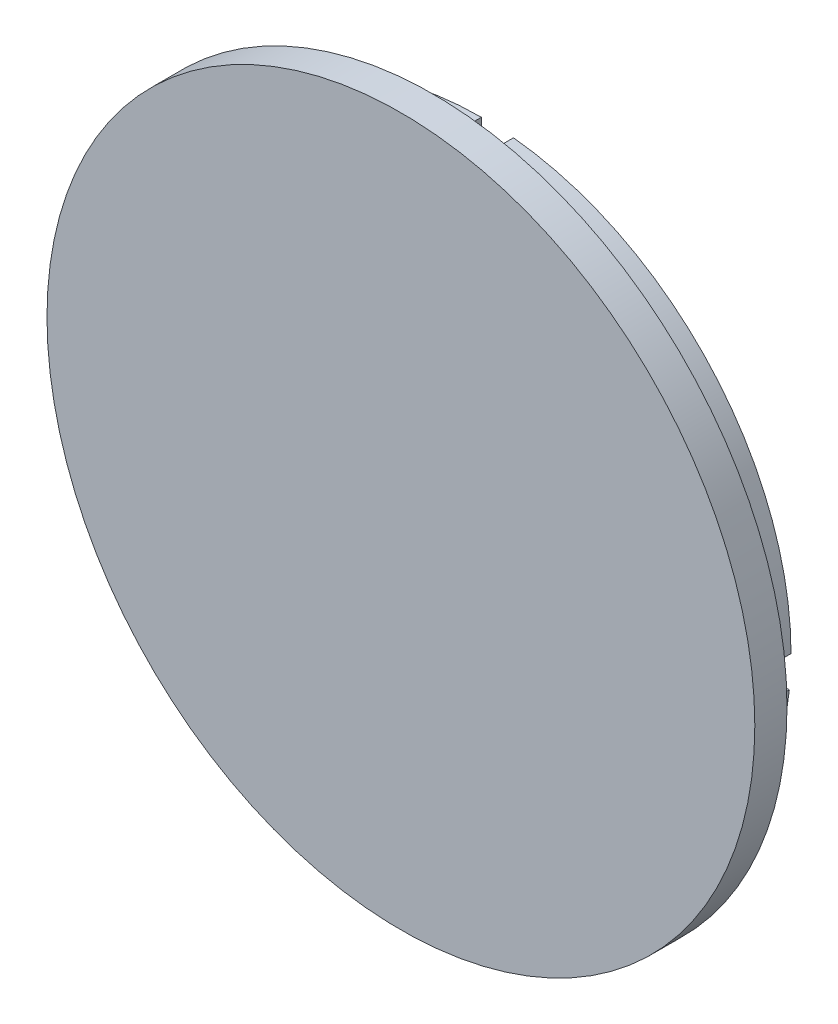
ISO-10303-21;
HEADER;
FILE_DESCRIPTION(('STEP AP214'),'2;1');
FILE_NAME('part.step','',(''),(''),'','','');
FILE_SCHEMA(('AUTOMOTIVE_DESIGN { 1 0 10303 214 1 1 1 1 }'));
ENDSEC;
DATA;
#1=APPLICATION_CONTEXT('core data for automotive mechanical design processes');
#2=APPLICATION_PROTOCOL_DEFINITION('international standard','automotive_design',2000,#1);
#3=PRODUCT_CONTEXT('',#1,'mechanical');
#4=PRODUCT('Part','Part','',(#3));
#5=PRODUCT_RELATED_PRODUCT_CATEGORY('part','',(#4));
#6=PRODUCT_DEFINITION_FORMATION('','',#4);
#7=PRODUCT_DEFINITION_CONTEXT('part definition',#1,'design');
#8=PRODUCT_DEFINITION('design','',#6,#7);
#9=PRODUCT_DEFINITION_SHAPE('','',#8);
#10=(LENGTH_UNIT() NAMED_UNIT(*) SI_UNIT(.MILLI.,.METRE.));
#11=(NAMED_UNIT(*) PLANE_ANGLE_UNIT() SI_UNIT($,.RADIAN.));
#12=(NAMED_UNIT(*) SI_UNIT($,.STERADIAN.) SOLID_ANGLE_UNIT());
#13=UNCERTAINTY_MEASURE_WITH_UNIT(LENGTH_MEASURE(1.E-05),#10,'distance_accuracy_value','');
#14=(GEOMETRIC_REPRESENTATION_CONTEXT(3) GLOBAL_UNCERTAINTY_ASSIGNED_CONTEXT((#13)) GLOBAL_UNIT_ASSIGNED_CONTEXT((#10,
#11,#12)) REPRESENTATION_CONTEXT('',''));
#15=CARTESIAN_POINT('',(0.,0.,0.));
#16=DIRECTION('',(0.,0.,1.));
#17=DIRECTION('',(1.,0.,0.));
#18=AXIS2_PLACEMENT_3D('',#15,#16,#17);
#19=CARTESIAN_POINT('',(0.,0.,0.));
#20=DIRECTION('',(0.,0.,1.));
#21=DIRECTION('',(1.,0.,0.));
#22=AXIS2_PLACEMENT_3D('',#19,#20,#21);
#23=PLANE('',#22);
#24=DIRECTION('',(1.,0.,0.));
#25=VECTOR('',#24,1.);
#26=CARTESIAN_POINT('',(0.,-2.00000000000007,0.));
#27=LINE('',#26,#25);
#28=CARTESIAN_POINT('',(-19.1458219985458,-2.,0.));
#29=VERTEX_POINT('',#28);
#30=CARTESIAN_POINT('',(-18.1400799336717,-2.,0.));
#31=VERTEX_POINT('',#30);
#32=EDGE_CURVE('E287',#29,#31,#27,.T.);
#33=ORIENTED_EDGE('',*,*,#32,.T.);
#34=CARTESIAN_POINT('',(0.,0.,0.));
#35=DIRECTION('',(0.,0.,1.));
#36=DIRECTION('',(1.,0.,0.));
#37=AXIS2_PLACEMENT_3D('',#34,#35,#36);
#38=CIRCLE('',#37,18.25);
#39=CARTESIAN_POINT('',(0.,-18.25,0.));
#40=VERTEX_POINT('',#39);
#41=EDGE_CURVE('E207',#31,#40,#38,.T.);
#42=ORIENTED_EDGE('',*,*,#41,.T.);
#43=DIRECTION('',(0.,-1.,0.));
#44=VECTOR('',#43,1.);
#45=CARTESIAN_POINT('',(0.,0.,0.));
#46=LINE('',#45,#44);
#47=CARTESIAN_POINT('',(0.,-19.25,0.));
#48=VERTEX_POINT('',#47);
#49=EDGE_CURVE('E273',#40,#48,#46,.T.);
#50=ORIENTED_EDGE('',*,*,#49,.T.);
#51=CARTESIAN_POINT('',(0.,0.,0.));
#52=DIRECTION('',(0.,0.,1.));
#53=DIRECTION('',(1.,0.,0.));
#54=AXIS2_PLACEMENT_3D('',#51,#52,#53);
#55=CIRCLE('',#54,19.25);
#56=EDGE_CURVE('E310',#29,#48,#55,.T.);
#57=ORIENTED_EDGE('',*,*,#56,.F.);
#58=EDGE_LOOP('',(#33,#42,#50,#57));
#59=FACE_BOUND('',#58,.T.);
#60=ADVANCED_FACE('F36',(#59),#23,.F.);
#61=CARTESIAN_POINT('',(0.,0.,3.));
#62=DIRECTION('',(0.,0.,-1.));
#63=DIRECTION('',(-1.,0.,0.));
#64=AXIS2_PLACEMENT_3D('',#61,#62,#63);
#65=CYLINDRICAL_SURFACE('',#64,19.25);
#66=DIRECTION('',(0.,0.,-1.));
#67=VECTOR('',#66,1.);
#68=CARTESIAN_POINT('',(-19.1458219985458,-2.,3.));
#69=LINE('',#68,#67);
#70=CARTESIAN_POINT('',(-19.1458219985458,-2.,3.));
#71=VERTEX_POINT('',#70);
#72=EDGE_CURVE('E160',#71,#29,#69,.T.);
#73=ORIENTED_EDGE('',*,*,#72,.T.);
#74=ORIENTED_EDGE('',*,*,#56,.T.);
#75=DIRECTION('',(0.,0.,-1.));
#76=VECTOR('',#75,1.);
#77=CARTESIAN_POINT('',(0.,-19.25,3.));
#78=LINE('',#77,#76);
#79=CARTESIAN_POINT('',(0.,-19.25,3.));
#80=VERTEX_POINT('',#79);
#81=EDGE_CURVE('E268',#80,#48,#78,.T.);
#82=ORIENTED_EDGE('',*,*,#81,.F.);
#83=CARTESIAN_POINT('',(0.,0.,3.));
#84=DIRECTION('',(0.,0.,1.));
#85=DIRECTION('',(1.,0.,0.));
#86=AXIS2_PLACEMENT_3D('',#83,#84,#85);
#87=CIRCLE('',#86,19.25);
#88=EDGE_CURVE('E45',#71,#80,#87,.T.);
#89=ORIENTED_EDGE('',*,*,#88,.F.);
#90=EDGE_LOOP('',(#73,#74,#82,#89));
#91=FACE_BOUND('',#90,.T.);
#92=ADVANCED_FACE('F332',(#91),#65,.T.);
#93=CARTESIAN_POINT('',(0.,0.,3.));
#94=DIRECTION('',(0.,0.,-1.));
#95=DIRECTION('',(-1.,0.,0.));
#96=AXIS2_PLACEMENT_3D('',#93,#94,#95);
#97=CYLINDRICAL_SURFACE('',#96,18.25);
#98=ORIENTED_EDGE('',*,*,#41,.F.);
#99=DIRECTION('',(0.,0.,-1.));
#100=VECTOR('',#99,1.);
#101=CARTESIAN_POINT('',(-18.1400799336717,-2.,3.));
#102=LINE('',#101,#100);
#103=CARTESIAN_POINT('',(-18.1400799336717,-2.,3.));
#104=VERTEX_POINT('',#103);
#105=EDGE_CURVE('E277',#104,#31,#102,.T.);
#106=ORIENTED_EDGE('',*,*,#105,.F.);
#107=CARTESIAN_POINT('',(0.,0.,3.));
#108=DIRECTION('',(0.,0.,1.));
#109=DIRECTION('',(1.,0.,0.));
#110=AXIS2_PLACEMENT_3D('',#107,#108,#109);
#111=CIRCLE('',#110,18.25);
#112=CARTESIAN_POINT('',(0.,-18.25,3.));
#113=VERTEX_POINT('',#112);
#114=EDGE_CURVE('E203',#104,#113,#111,.T.);
#115=ORIENTED_EDGE('',*,*,#114,.T.);
#116=DIRECTION('',(0.,0.,-1.));
#117=VECTOR('',#116,1.);
#118=CARTESIAN_POINT('',(0.,-18.25,3.));
#119=LINE('',#118,#117);
#120=EDGE_CURVE('E238',#113,#40,#119,.T.);
#121=ORIENTED_EDGE('',*,*,#120,.T.);
#122=EDGE_LOOP('',(#98,#106,#115,#121));
#123=FACE_BOUND('',#122,.T.);
#124=ADVANCED_FACE('F296',(#123),#97,.F.);
#125=CARTESIAN_POINT('',(0.,18.25,0.));
#126=VERTEX_POINT('',#125);
#127=CARTESIAN_POINT('',(-18.25,0.,0.));
#128=VERTEX_POINT('',#127);
#129=EDGE_CURVE('E204',#126,#128,#38,.T.);
#130=ORIENTED_EDGE('',*,*,#129,.T.);
#131=DIRECTION('',(1.,0.,0.));
#132=VECTOR('',#131,1.);
#133=CARTESIAN_POINT('',(0.,0.,0.));
#134=LINE('',#133,#132);
#135=CARTESIAN_POINT('',(-19.25,0.,0.));
#136=VERTEX_POINT('',#135);
#137=EDGE_CURVE('E285',#136,#128,#134,.T.);
#138=ORIENTED_EDGE('',*,*,#137,.F.);
#139=CARTESIAN_POINT('',(0.,19.25,0.));
#140=VERTEX_POINT('',#139);
#141=EDGE_CURVE('E40',#140,#136,#55,.T.);
#142=ORIENTED_EDGE('',*,*,#141,.F.);
#143=DIRECTION('',(0.,-1.,0.));
#144=VECTOR('',#143,1.);
#145=CARTESIAN_POINT('',(0.,0.,0.));
#146=LINE('',#145,#144);
#147=EDGE_CURVE('E182',#140,#126,#146,.T.);
#148=ORIENTED_EDGE('',*,*,#147,.T.);
#149=EDGE_LOOP('',(#130,#138,#142,#148));
#150=FACE_BOUND('',#149,.T.);
#151=ADVANCED_FACE('F334',(#150),#23,.F.);
#152=ORIENTED_EDGE('',*,*,#141,.T.);
#153=DIRECTION('',(0.,0.,-1.));
#154=VECTOR('',#153,1.);
#155=CARTESIAN_POINT('',(-19.25,0.,3.));
#156=LINE('',#155,#154);
#157=CARTESIAN_POINT('',(-19.25,0.,3.));
#158=VERTEX_POINT('',#157);
#159=EDGE_CURVE('E153',#158,#136,#156,.T.);
#160=ORIENTED_EDGE('',*,*,#159,.F.);
#161=CARTESIAN_POINT('',(0.,19.25,3.));
#162=VERTEX_POINT('',#161);
#163=EDGE_CURVE('E12',#162,#158,#87,.T.);
#164=ORIENTED_EDGE('',*,*,#163,.F.);
#165=DIRECTION('',(0.,0.,-1.));
#166=VECTOR('',#165,1.);
#167=CARTESIAN_POINT('',(0.,19.25,3.));
#168=LINE('',#167,#166);
#169=EDGE_CURVE('E179',#162,#140,#168,.T.);
#170=ORIENTED_EDGE('',*,*,#169,.T.);
#171=EDGE_LOOP('',(#152,#160,#164,#170));
#172=FACE_BOUND('',#171,.T.);
#173=ADVANCED_FACE('F165',(#172),#65,.T.);
#174=DIRECTION('',(0.,0.,-1.));
#175=VECTOR('',#174,1.);
#176=CARTESIAN_POINT('',(-18.25,0.,3.));
#177=LINE('',#176,#175);
#178=CARTESIAN_POINT('',(-18.25,0.,3.));
#179=VERTEX_POINT('',#178);
#180=EDGE_CURVE('E156',#179,#128,#177,.T.);
#181=ORIENTED_EDGE('',*,*,#180,.T.);
#182=ORIENTED_EDGE('',*,*,#129,.F.);
#183=DIRECTION('',(0.,0.,-1.));
#184=VECTOR('',#183,1.);
#185=CARTESIAN_POINT('',(0.,18.25,3.));
#186=LINE('',#185,#184);
#187=CARTESIAN_POINT('',(0.,18.25,3.));
#188=VERTEX_POINT('',#187);
#189=EDGE_CURVE('E184',#188,#126,#186,.T.);
#190=ORIENTED_EDGE('',*,*,#189,.F.);
#191=EDGE_CURVE('E173',#188,#179,#111,.T.);
#192=ORIENTED_EDGE('',*,*,#191,.T.);
#193=EDGE_LOOP('',(#181,#182,#190,#192));
#194=FACE_BOUND('',#193,.T.);
#195=ADVANCED_FACE('F345',(#194),#97,.F.);
#196=CARTESIAN_POINT('',(2.,-19.1458219985458,0.));
#197=VERTEX_POINT('',#196);
#198=CARTESIAN_POINT('',(19.1458219985458,-2.,0.));
#199=VERTEX_POINT('',#198);
#200=EDGE_CURVE('E210',#197,#199,#55,.T.);
#201=ORIENTED_EDGE('',*,*,#200,.F.);
#202=DIRECTION('',(0.,-1.,0.));
#203=VECTOR('',#202,1.);
#204=CARTESIAN_POINT('',(2.00000000000001,0.,0.));
#205=LINE('',#204,#203);
#206=CARTESIAN_POINT('',(2.,-18.1400799336717,0.));
#207=VERTEX_POINT('',#206);
#208=EDGE_CURVE('E225',#207,#197,#205,.T.);
#209=ORIENTED_EDGE('',*,*,#208,.F.);
#210=CARTESIAN_POINT('',(18.1400799336717,-2.,0.));
#211=VERTEX_POINT('',#210);
#212=EDGE_CURVE('E211',#207,#211,#38,.T.);
#213=ORIENTED_EDGE('',*,*,#212,.T.);
#214=DIRECTION('',(1.,0.,0.));
#215=VECTOR('',#214,1.);
#216=CARTESIAN_POINT('',(0.,-1.99999999999999,0.));
#217=LINE('',#216,#215);
#218=EDGE_CURVE('E224',#211,#199,#217,.T.);
#219=ORIENTED_EDGE('',*,*,#218,.T.);
#220=EDGE_LOOP('',(#201,#209,#213,#219));
#221=FACE_BOUND('',#220,.T.);
#222=ADVANCED_FACE('F223',(#221),#23,.F.);
#223=CARTESIAN_POINT('',(2.,-19.1458219985458,3.));
#224=VERTEX_POINT('',#223);
#225=CARTESIAN_POINT('',(19.1458219985458,-2.,3.));
#226=VERTEX_POINT('',#225);
#227=EDGE_CURVE('E309',#224,#226,#87,.T.);
#228=ORIENTED_EDGE('',*,*,#227,.F.);
#229=DIRECTION('',(0.,0.,-1.));
#230=VECTOR('',#229,1.);
#231=CARTESIAN_POINT('',(2.,-19.1458219985458,3.));
#232=LINE('',#231,#230);
#233=EDGE_CURVE('E264',#224,#197,#232,.T.);
#234=ORIENTED_EDGE('',*,*,#233,.T.);
#235=ORIENTED_EDGE('',*,*,#200,.T.);
#236=DIRECTION('',(0.,0.,-1.));
#237=VECTOR('',#236,1.);
#238=CARTESIAN_POINT('',(19.1458219985458,-2.,3.));
#239=LINE('',#238,#237);
#240=EDGE_CURVE('E236',#226,#199,#239,.T.);
#241=ORIENTED_EDGE('',*,*,#240,.F.);
#242=EDGE_LOOP('',(#228,#234,#235,#241));
#243=FACE_BOUND('',#242,.T.);
#244=ADVANCED_FACE('F316',(#243),#65,.T.);
#245=DIRECTION('',(0.,0.,-1.));
#246=VECTOR('',#245,1.);
#247=CARTESIAN_POINT('',(2.,-18.1400799336717,3.));
#248=LINE('',#247,#246);
#249=CARTESIAN_POINT('',(2.,-18.1400799336717,3.));
#250=VERTEX_POINT('',#249);
#251=EDGE_CURVE('E262',#250,#207,#248,.T.);
#252=ORIENTED_EDGE('',*,*,#251,.F.);
#253=CARTESIAN_POINT('',(18.1400799336717,-2.,3.));
#254=VERTEX_POINT('',#253);
#255=EDGE_CURVE('E241',#250,#254,#111,.T.);
#256=ORIENTED_EDGE('',*,*,#255,.T.);
#257=DIRECTION('',(0.,0.,-1.));
#258=VECTOR('',#257,1.);
#259=CARTESIAN_POINT('',(18.1400799336717,-2.,3.));
#260=LINE('',#259,#258);
#261=EDGE_CURVE('E234',#254,#211,#260,.T.);
#262=ORIENTED_EDGE('',*,*,#261,.T.);
#263=ORIENTED_EDGE('',*,*,#212,.F.);
#264=EDGE_LOOP('',(#252,#256,#262,#263));
#265=FACE_BOUND('',#264,.T.);
#266=ADVANCED_FACE('F240',(#265),#97,.F.);
#267=CARTESIAN_POINT('',(19.25,0.,0.));
#268=VERTEX_POINT('',#267);
#269=CARTESIAN_POINT('',(2.,19.1458219985458,0.));
#270=VERTEX_POINT('',#269);
#271=EDGE_CURVE('E206',#268,#270,#55,.T.);
#272=ORIENTED_EDGE('',*,*,#271,.F.);
#273=DIRECTION('',(1.,0.,0.));
#274=VECTOR('',#273,1.);
#275=CARTESIAN_POINT('',(0.,0.,0.));
#276=LINE('',#275,#274);
#277=CARTESIAN_POINT('',(18.25,0.,0.));
#278=VERTEX_POINT('',#277);
#279=EDGE_CURVE('E237',#278,#268,#276,.T.);
#280=ORIENTED_EDGE('',*,*,#279,.F.);
#281=CARTESIAN_POINT('',(2.,18.1400799336717,0.));
#282=VERTEX_POINT('',#281);
#283=EDGE_CURVE('E202',#278,#282,#38,.T.);
#284=ORIENTED_EDGE('',*,*,#283,.T.);
#285=DIRECTION('',(0.,-1.,0.));
#286=VECTOR('',#285,1.);
#287=CARTESIAN_POINT('',(1.99999999999993,0.,0.));
#288=LINE('',#287,#286);
#289=EDGE_CURVE('E254',#270,#282,#288,.T.);
#290=ORIENTED_EDGE('',*,*,#289,.F.);
#291=EDGE_LOOP('',(#272,#280,#284,#290));
#292=FACE_BOUND('',#291,.T.);
#293=ADVANCED_FACE('F335',(#292),#23,.F.);
#294=CARTESIAN_POINT('',(19.25,0.,3.));
#295=VERTEX_POINT('',#294);
#296=CARTESIAN_POINT('',(2.,19.1458219985458,3.));
#297=VERTEX_POINT('',#296);
#298=EDGE_CURVE('E46',#295,#297,#87,.T.);
#299=ORIENTED_EDGE('',*,*,#298,.F.);
#300=DIRECTION('',(0.,0.,-1.));
#301=VECTOR('',#300,1.);
#302=CARTESIAN_POINT('',(19.25,0.,3.));
#303=LINE('',#302,#301);
#304=EDGE_CURVE('E246',#295,#268,#303,.T.);
#305=ORIENTED_EDGE('',*,*,#304,.T.);
#306=ORIENTED_EDGE('',*,*,#271,.T.);
#307=DIRECTION('',(0.,0.,-1.));
#308=VECTOR('',#307,1.);
#309=CARTESIAN_POINT('',(2.,19.1458219985458,3.));
#310=LINE('',#309,#308);
#311=EDGE_CURVE('E176',#297,#270,#310,.T.);
#312=ORIENTED_EDGE('',*,*,#311,.F.);
#313=EDGE_LOOP('',(#299,#305,#306,#312));
#314=FACE_BOUND('',#313,.T.);
#315=ADVANCED_FACE('F38',(#314),#65,.T.);
#316=DIRECTION('',(0.,0.,-1.));
#317=VECTOR('',#316,1.);
#318=CARTESIAN_POINT('',(18.25,0.,3.));
#319=LINE('',#318,#317);
#320=CARTESIAN_POINT('',(18.25,0.,3.));
#321=VERTEX_POINT('',#320);
#322=EDGE_CURVE('E243',#321,#278,#319,.T.);
#323=ORIENTED_EDGE('',*,*,#322,.F.);
#324=CARTESIAN_POINT('',(2.,18.1400799336717,3.));
#325=VERTEX_POINT('',#324);
#326=EDGE_CURVE('E199',#321,#325,#111,.T.);
#327=ORIENTED_EDGE('',*,*,#326,.T.);
#328=DIRECTION('',(0.,0.,-1.));
#329=VECTOR('',#328,1.);
#330=CARTESIAN_POINT('',(2.,18.1400799336717,3.));
#331=LINE('',#330,#329);
#332=EDGE_CURVE('E189',#325,#282,#331,.T.);
#333=ORIENTED_EDGE('',*,*,#332,.T.);
#334=ORIENTED_EDGE('',*,*,#283,.F.);
#335=EDGE_LOOP('',(#323,#327,#333,#334));
#336=FACE_BOUND('',#335,.T.);
#337=ADVANCED_FACE('F302',(#336),#97,.F.);
#338=CARTESIAN_POINT('',(0.,0.,3.));
#339=DIRECTION('',(0.,0.,1.));
#340=DIRECTION('',(1.,0.,0.));
#341=AXIS2_PLACEMENT_3D('',#338,#339,#340);
#342=PLANE('',#341);
#343=ORIENTED_EDGE('',*,*,#114,.F.);
#344=DIRECTION('',(1.,0.,0.));
#345=VECTOR('',#344,1.);
#346=CARTESIAN_POINT('',(0.,-2.00000000000007,3.));
#347=LINE('',#346,#345);
#348=EDGE_CURVE('E53',#71,#104,#347,.T.);
#349=ORIENTED_EDGE('',*,*,#348,.F.);
#350=ORIENTED_EDGE('',*,*,#88,.T.);
#351=DIRECTION('',(0.,-1.,0.));
#352=VECTOR('',#351,1.);
#353=CARTESIAN_POINT('',(0.,0.,3.));
#354=LINE('',#353,#352);
#355=EDGE_CURVE('E265',#113,#80,#354,.T.);
#356=ORIENTED_EDGE('',*,*,#355,.F.);
#357=EDGE_LOOP('',(#343,#349,#350,#356));
#358=FACE_BOUND('',#357,.T.);
#359=ORIENTED_EDGE('',*,*,#255,.F.);
#360=DIRECTION('',(0.,-1.,0.));
#361=VECTOR('',#360,1.);
#362=CARTESIAN_POINT('',(2.00000000000001,0.,3.));
#363=LINE('',#362,#361);
#364=EDGE_CURVE('E61',#250,#224,#363,.T.);
#365=ORIENTED_EDGE('',*,*,#364,.T.);
#366=ORIENTED_EDGE('',*,*,#227,.T.);
#367=DIRECTION('',(1.,0.,0.));
#368=VECTOR('',#367,1.);
#369=CARTESIAN_POINT('',(0.,-1.99999999999999,3.));
#370=LINE('',#369,#368);
#371=EDGE_CURVE('E249',#254,#226,#370,.T.);
#372=ORIENTED_EDGE('',*,*,#371,.F.);
#373=EDGE_LOOP('',(#359,#365,#366,#372));
#374=FACE_BOUND('',#373,.T.);
#375=ORIENTED_EDGE('',*,*,#163,.T.);
#376=DIRECTION('',(1.,0.,0.));
#377=VECTOR('',#376,1.);
#378=CARTESIAN_POINT('',(0.,0.,3.));
#379=LINE('',#378,#377);
#380=EDGE_CURVE('E150',#158,#179,#379,.T.);
#381=ORIENTED_EDGE('',*,*,#380,.T.);
#382=ORIENTED_EDGE('',*,*,#191,.F.);
#383=DIRECTION('',(0.,-1.,0.));
#384=VECTOR('',#383,1.);
#385=CARTESIAN_POINT('',(0.,0.,3.));
#386=LINE('',#385,#384);
#387=EDGE_CURVE('E171',#162,#188,#386,.T.);
#388=ORIENTED_EDGE('',*,*,#387,.F.);
#389=EDGE_LOOP('',(#375,#381,#382,#388));
#390=FACE_BOUND('',#389,.T.);
#391=CARTESIAN_POINT('',(0.,0.,3.));
#392=DIRECTION('',(0.,0.,1.));
#393=DIRECTION('',(1.,0.,0.));
#394=AXIS2_PLACEMENT_3D('',#391,#392,#393);
#395=CIRCLE('',#394,22.);
#396=CARTESIAN_POINT('',(22.,0.,3.));
#397=VERTEX_POINT('',#396);
#398=EDGE_CURVE('E183',#397,#397,#395,.T.);
#399=ORIENTED_EDGE('',*,*,#398,.F.);
#400=EDGE_LOOP('',(#399));
#401=FACE_BOUND('',#400,.T.);
#402=DIRECTION('',(1.,0.,0.));
#403=VECTOR('',#402,1.);
#404=CARTESIAN_POINT('',(0.,0.,3.));
#405=LINE('',#404,#403);
#406=EDGE_CURVE('E244',#321,#295,#405,.T.);
#407=ORIENTED_EDGE('',*,*,#406,.T.);
#408=ORIENTED_EDGE('',*,*,#298,.T.);
#409=DIRECTION('',(0.,-1.,0.));
#410=VECTOR('',#409,1.);
#411=CARTESIAN_POINT('',(1.99999999999993,0.,3.));
#412=LINE('',#411,#410);
#413=EDGE_CURVE('E177',#297,#325,#412,.T.);
#414=ORIENTED_EDGE('',*,*,#413,.T.);
#415=ORIENTED_EDGE('',*,*,#326,.F.);
#416=EDGE_LOOP('',(#407,#408,#414,#415));
#417=FACE_BOUND('',#416,.T.);
#418=ADVANCED_FACE('F169',(#358,#374,#390,#401,#417),#342,.F.);
#419=CARTESIAN_POINT('',(0.,0.,5.));
#420=DIRECTION('',(0.,0.,-1.));
#421=DIRECTION('',(-1.,0.,0.));
#422=AXIS2_PLACEMENT_3D('',#419,#420,#421);
#423=CYLINDRICAL_SURFACE('',#422,22.);
#424=CARTESIAN_POINT('',(0.,0.,5.));
#425=DIRECTION('',(0.,0.,1.));
#426=DIRECTION('',(1.,0.,0.));
#427=AXIS2_PLACEMENT_3D('',#424,#425,#426);
#428=CIRCLE('',#427,22.);
#429=CARTESIAN_POINT('',(22.,0.,5.));
#430=VERTEX_POINT('',#429);
#431=EDGE_CURVE('E187',#430,#430,#428,.T.);
#432=ORIENTED_EDGE('',*,*,#431,.F.);
#433=EDGE_LOOP('',(#432));
#434=FACE_BOUND('',#433,.T.);
#435=ORIENTED_EDGE('',*,*,#398,.T.);
#436=EDGE_LOOP('',(#435));
#437=FACE_BOUND('',#436,.T.);
#438=ADVANCED_FACE('F320',(#434,#437),#423,.T.);
#439=CARTESIAN_POINT('',(0.,0.,5.));
#440=DIRECTION('',(0.,0.,1.));
#441=DIRECTION('',(1.,0.,0.));
#442=AXIS2_PLACEMENT_3D('',#439,#440,#441);
#443=PLANE('',#442);
#444=ORIENTED_EDGE('',*,*,#431,.T.);
#445=EDGE_LOOP('',(#444));
#446=FACE_BOUND('',#445,.T.);
#447=ADVANCED_FACE('F326',(#446),#443,.T.);
#448=CARTESIAN_POINT('',(0.,0.,3.));
#449=DIRECTION('',(1.,0.,0.));
#450=DIRECTION('',(0.,1.,0.));
#451=AXIS2_PLACEMENT_3D('',#448,#449,#450);
#452=PLANE('',#451);
#453=ORIENTED_EDGE('',*,*,#147,.F.);
#454=ORIENTED_EDGE('',*,*,#169,.F.);
#455=ORIENTED_EDGE('',*,*,#387,.T.);
#456=ORIENTED_EDGE('',*,*,#189,.T.);
#457=EDGE_LOOP('',(#453,#454,#455,#456));
#458=FACE_BOUND('',#457,.T.);
#459=ADVANCED_FACE('F180',(#458),#452,.T.);
#460=CARTESIAN_POINT('',(1.99999999999993,0.,3.));
#461=DIRECTION('',(1.,0.,0.));
#462=DIRECTION('',(0.,1.,0.));
#463=AXIS2_PLACEMENT_3D('',#460,#461,#462);
#464=PLANE('',#463);
#465=ORIENTED_EDGE('',*,*,#289,.T.);
#466=ORIENTED_EDGE('',*,*,#332,.F.);
#467=ORIENTED_EDGE('',*,*,#413,.F.);
#468=ORIENTED_EDGE('',*,*,#311,.T.);
#469=EDGE_LOOP('',(#465,#466,#467,#468));
#470=FACE_BOUND('',#469,.T.);
#471=ADVANCED_FACE('F305',(#470),#464,.F.);
#472=CARTESIAN_POINT('',(0.,-1.99999999999999,3.));
#473=DIRECTION('',(0.,1.,0.));
#474=DIRECTION('',(-1.,0.,0.));
#475=AXIS2_PLACEMENT_3D('',#472,#473,#474);
#476=PLANE('',#475);
#477=ORIENTED_EDGE('',*,*,#218,.F.);
#478=ORIENTED_EDGE('',*,*,#261,.F.);
#479=ORIENTED_EDGE('',*,*,#371,.T.);
#480=ORIENTED_EDGE('',*,*,#240,.T.);
#481=EDGE_LOOP('',(#477,#478,#479,#480));
#482=FACE_BOUND('',#481,.T.);
#483=ADVANCED_FACE('F232',(#482),#476,.T.);
#484=CARTESIAN_POINT('',(0.,0.,3.));
#485=DIRECTION('',(0.,1.,0.));
#486=DIRECTION('',(-1.,0.,0.));
#487=AXIS2_PLACEMENT_3D('',#484,#485,#486);
#488=PLANE('',#487);
#489=ORIENTED_EDGE('',*,*,#279,.T.);
#490=ORIENTED_EDGE('',*,*,#304,.F.);
#491=ORIENTED_EDGE('',*,*,#406,.F.);
#492=ORIENTED_EDGE('',*,*,#322,.T.);
#493=EDGE_LOOP('',(#489,#490,#491,#492));
#494=FACE_BOUND('',#493,.T.);
#495=ADVANCED_FACE('F438',(#494),#488,.F.);
#496=CARTESIAN_POINT('',(0.,0.,3.));
#497=DIRECTION('',(1.,0.,0.));
#498=DIRECTION('',(0.,1.,0.));
#499=AXIS2_PLACEMENT_3D('',#496,#497,#498);
#500=PLANE('',#499);
#501=ORIENTED_EDGE('',*,*,#49,.F.);
#502=ORIENTED_EDGE('',*,*,#120,.F.);
#503=ORIENTED_EDGE('',*,*,#355,.T.);
#504=ORIENTED_EDGE('',*,*,#81,.T.);
#505=EDGE_LOOP('',(#501,#502,#503,#504));
#506=FACE_BOUND('',#505,.T.);
#507=ADVANCED_FACE('F447',(#506),#500,.T.);
#508=CARTESIAN_POINT('',(2.00000000000001,0.,3.));
#509=DIRECTION('',(1.,0.,0.));
#510=DIRECTION('',(0.,1.,0.));
#511=AXIS2_PLACEMENT_3D('',#508,#509,#510);
#512=PLANE('',#511);
#513=ORIENTED_EDGE('',*,*,#208,.T.);
#514=ORIENTED_EDGE('',*,*,#233,.F.);
#515=ORIENTED_EDGE('',*,*,#364,.F.);
#516=ORIENTED_EDGE('',*,*,#251,.T.);
#517=EDGE_LOOP('',(#513,#514,#515,#516));
#518=FACE_BOUND('',#517,.T.);
#519=ADVANCED_FACE('F318',(#518),#512,.F.);
#520=CARTESIAN_POINT('',(0.,-2.00000000000007,3.));
#521=DIRECTION('',(0.,1.,0.));
#522=DIRECTION('',(-1.,0.,0.));
#523=AXIS2_PLACEMENT_3D('',#520,#521,#522);
#524=PLANE('',#523);
#525=ORIENTED_EDGE('',*,*,#32,.F.);
#526=ORIENTED_EDGE('',*,*,#72,.F.);
#527=ORIENTED_EDGE('',*,*,#348,.T.);
#528=ORIENTED_EDGE('',*,*,#105,.T.);
#529=EDGE_LOOP('',(#525,#526,#527,#528));
#530=FACE_BOUND('',#529,.T.);
#531=ADVANCED_FACE('F292',(#530),#524,.T.);
#532=CARTESIAN_POINT('',(0.,0.,3.));
#533=DIRECTION('',(0.,1.,0.));
#534=DIRECTION('',(-1.,0.,0.));
#535=AXIS2_PLACEMENT_3D('',#532,#533,#534);
#536=PLANE('',#535);
#537=ORIENTED_EDGE('',*,*,#137,.T.);
#538=ORIENTED_EDGE('',*,*,#180,.F.);
#539=ORIENTED_EDGE('',*,*,#380,.F.);
#540=ORIENTED_EDGE('',*,*,#159,.T.);
#541=EDGE_LOOP('',(#537,#538,#539,#540));
#542=FACE_BOUND('',#541,.T.);
#543=ADVANCED_FACE('F152',(#542),#536,.F.);
#544=CLOSED_SHELL('',(#60,#92,#124,#151,#173,#195,#222,#244,#266,#293,#315,#337,#418,#438,#447,
#459,#471,#483,#495,#507,#519,#531,#543));
#545=MANIFOLD_SOLID_BREP('B2',#544);
#546=ADVANCED_BREP_SHAPE_REPRESENTATION('',(#18,#545),#14);
#547=SHAPE_DEFINITION_REPRESENTATION(#9,#546);
ENDSEC;
END-ISO-10303-21;
